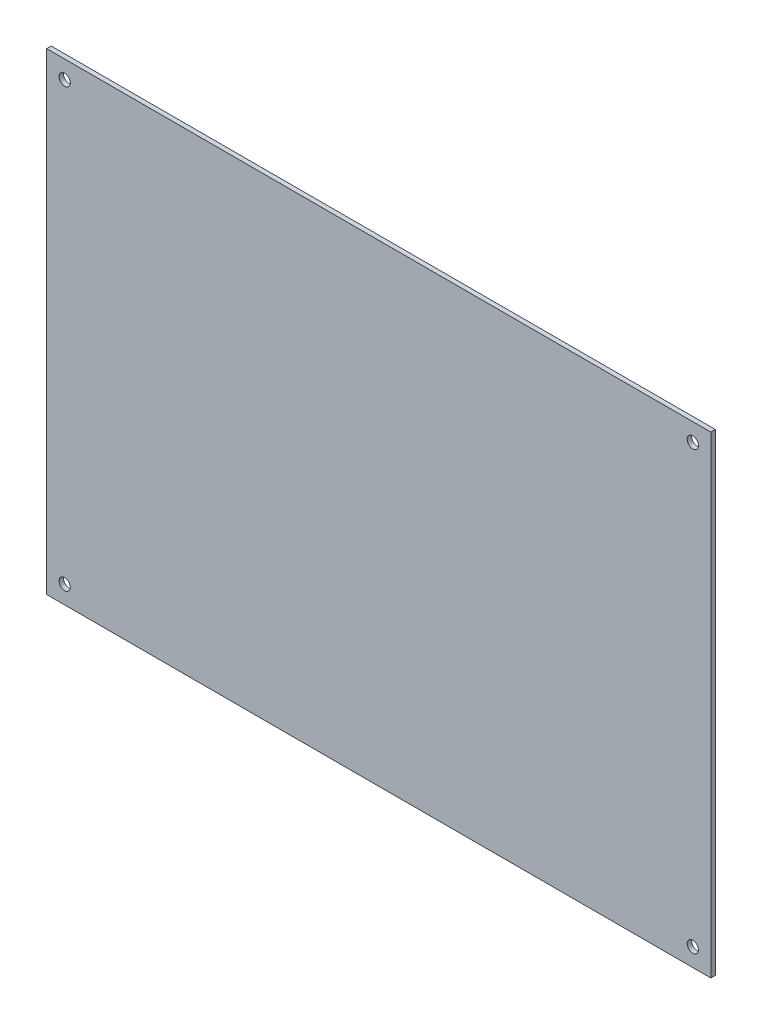
ISO-10303-21;
HEADER;
FILE_DESCRIPTION(('STEP AP214'),'2;1');
FILE_NAME('part.step','',(''),(''),'','','');
FILE_SCHEMA(('AUTOMOTIVE_DESIGN { 1 0 10303 214 1 1 1 1 }'));
ENDSEC;
DATA;
#1=APPLICATION_CONTEXT('core data for automotive mechanical design processes');
#2=APPLICATION_PROTOCOL_DEFINITION('international standard','automotive_design',2000,#1);
#3=PRODUCT_CONTEXT('',#1,'mechanical');
#4=PRODUCT('Part','Part','',(#3));
#5=PRODUCT_RELATED_PRODUCT_CATEGORY('part','',(#4));
#6=PRODUCT_DEFINITION_FORMATION('','',#4);
#7=PRODUCT_DEFINITION_CONTEXT('part definition',#1,'design');
#8=PRODUCT_DEFINITION('design','',#6,#7);
#9=PRODUCT_DEFINITION_SHAPE('','',#8);
#10=(LENGTH_UNIT() NAMED_UNIT(*) SI_UNIT(.MILLI.,.METRE.));
#11=(NAMED_UNIT(*) PLANE_ANGLE_UNIT() SI_UNIT($,.RADIAN.));
#12=(NAMED_UNIT(*) SI_UNIT($,.STERADIAN.) SOLID_ANGLE_UNIT());
#13=UNCERTAINTY_MEASURE_WITH_UNIT(LENGTH_MEASURE(1.E-05),#10,'distance_accuracy_value','');
#14=(GEOMETRIC_REPRESENTATION_CONTEXT(3) GLOBAL_UNCERTAINTY_ASSIGNED_CONTEXT((#13)) GLOBAL_UNIT_ASSIGNED_CONTEXT((#10,
#11,#12)) REPRESENTATION_CONTEXT('',''));
#15=CARTESIAN_POINT('',(0.,0.,0.));
#16=DIRECTION('',(0.,0.,1.));
#17=DIRECTION('',(1.,0.,0.));
#18=AXIS2_PLACEMENT_3D('',#15,#16,#17);
#19=CARTESIAN_POINT('',(147.5,105.,2.));
#20=DIRECTION('',(-1.,0.,0.));
#21=DIRECTION('',(0.,0.,1.));
#22=AXIS2_PLACEMENT_3D('',#19,#20,#21);
#23=PLANE('',#22);
#24=DIRECTION('',(0.,1.,0.));
#25=VECTOR('',#24,1.);
#26=CARTESIAN_POINT('',(147.5,105.,0.));
#27=LINE('',#26,#25);
#28=CARTESIAN_POINT('',(147.5,-105.,0.));
#29=VERTEX_POINT('',#28);
#30=CARTESIAN_POINT('',(147.5,105.,0.));
#31=VERTEX_POINT('',#30);
#32=EDGE_CURVE('E99',#29,#31,#27,.T.);
#33=ORIENTED_EDGE('',*,*,#32,.T.);
#34=DIRECTION('',(0.,0.,-1.));
#35=VECTOR('',#34,1.);
#36=CARTESIAN_POINT('',(147.5,105.,2.));
#37=LINE('',#36,#35);
#38=CARTESIAN_POINT('',(147.5,105.,2.));
#39=VERTEX_POINT('',#38);
#40=EDGE_CURVE('E11',#39,#31,#37,.T.);
#41=ORIENTED_EDGE('',*,*,#40,.F.);
#42=DIRECTION('',(0.,1.,0.));
#43=VECTOR('',#42,1.);
#44=CARTESIAN_POINT('',(147.5,105.,2.));
#45=LINE('',#44,#43);
#46=CARTESIAN_POINT('',(147.5,-105.,2.));
#47=VERTEX_POINT('',#46);
#48=EDGE_CURVE('E86',#47,#39,#45,.T.);
#49=ORIENTED_EDGE('',*,*,#48,.F.);
#50=DIRECTION('',(0.,0.,-1.));
#51=VECTOR('',#50,1.);
#52=CARTESIAN_POINT('',(147.5,-105.,2.));
#53=LINE('',#52,#51);
#54=EDGE_CURVE('E95',#47,#29,#53,.T.);
#55=ORIENTED_EDGE('',*,*,#54,.T.);
#56=EDGE_LOOP('',(#33,#41,#49,#55));
#57=FACE_BOUND('',#56,.T.);
#58=ADVANCED_FACE('F33',(#57),#23,.F.);
#59=CARTESIAN_POINT('',(147.5,105.,2.));
#60=DIRECTION('',(0.,-1.,0.));
#61=DIRECTION('',(1.,0.,0.));
#62=AXIS2_PLACEMENT_3D('',#59,#60,#61);
#63=PLANE('',#62);
#64=DIRECTION('',(-1.,0.,0.));
#65=VECTOR('',#64,1.);
#66=CARTESIAN_POINT('',(147.5,105.,0.));
#67=LINE('',#66,#65);
#68=CARTESIAN_POINT('',(-147.5,105.,0.));
#69=VERTEX_POINT('',#68);
#70=EDGE_CURVE('E90',#31,#69,#67,.T.);
#71=ORIENTED_EDGE('',*,*,#70,.T.);
#72=DIRECTION('',(0.,0.,-1.));
#73=VECTOR('',#72,1.);
#74=CARTESIAN_POINT('',(-147.5,105.,2.));
#75=LINE('',#74,#73);
#76=CARTESIAN_POINT('',(-147.5,105.,2.));
#77=VERTEX_POINT('',#76);
#78=EDGE_CURVE('E42',#77,#69,#75,.T.);
#79=ORIENTED_EDGE('',*,*,#78,.F.);
#80=DIRECTION('',(-1.,0.,0.));
#81=VECTOR('',#80,1.);
#82=CARTESIAN_POINT('',(147.5,105.,2.));
#83=LINE('',#82,#81);
#84=EDGE_CURVE('E81',#39,#77,#83,.T.);
#85=ORIENTED_EDGE('',*,*,#84,.F.);
#86=ORIENTED_EDGE('',*,*,#40,.T.);
#87=EDGE_LOOP('',(#71,#79,#85,#86));
#88=FACE_BOUND('',#87,.T.);
#89=ADVANCED_FACE('F89',(#88),#63,.F.);
#90=CARTESIAN_POINT('',(-147.5,105.,2.));
#91=DIRECTION('',(1.,0.,0.));
#92=DIRECTION('',(0.,1.,0.));
#93=AXIS2_PLACEMENT_3D('',#90,#91,#92);
#94=PLANE('',#93);
#95=DIRECTION('',(0.,-1.,0.));
#96=VECTOR('',#95,1.);
#97=CARTESIAN_POINT('',(-147.5,105.,0.));
#98=LINE('',#97,#96);
#99=CARTESIAN_POINT('',(-147.5,-105.,0.));
#100=VERTEX_POINT('',#99);
#101=EDGE_CURVE('E68',#69,#100,#98,.T.);
#102=ORIENTED_EDGE('',*,*,#101,.T.);
#103=DIRECTION('',(0.,0.,-1.));
#104=VECTOR('',#103,1.);
#105=CARTESIAN_POINT('',(-147.5,-105.,2.));
#106=LINE('',#105,#104);
#107=CARTESIAN_POINT('',(-147.5,-105.,2.));
#108=VERTEX_POINT('',#107);
#109=EDGE_CURVE('E91',#108,#100,#106,.T.);
#110=ORIENTED_EDGE('',*,*,#109,.F.);
#111=DIRECTION('',(0.,-1.,0.));
#112=VECTOR('',#111,1.);
#113=CARTESIAN_POINT('',(-147.5,105.,2.));
#114=LINE('',#113,#112);
#115=EDGE_CURVE('E84',#77,#108,#114,.T.);
#116=ORIENTED_EDGE('',*,*,#115,.F.);
#117=ORIENTED_EDGE('',*,*,#78,.T.);
#118=EDGE_LOOP('',(#102,#110,#116,#117));
#119=FACE_BOUND('',#118,.T.);
#120=ADVANCED_FACE('F93',(#119),#94,.F.);
#121=CARTESIAN_POINT('',(147.5,-105.,2.));
#122=DIRECTION('',(0.,1.,0.));
#123=DIRECTION('',(-1.,0.,0.));
#124=AXIS2_PLACEMENT_3D('',#121,#122,#123);
#125=PLANE('',#124);
#126=DIRECTION('',(1.,0.,0.));
#127=VECTOR('',#126,1.);
#128=CARTESIAN_POINT('',(147.5,-105.,0.));
#129=LINE('',#128,#127);
#130=EDGE_CURVE('E74',#100,#29,#129,.T.);
#131=ORIENTED_EDGE('',*,*,#130,.T.);
#132=ORIENTED_EDGE('',*,*,#54,.F.);
#133=DIRECTION('',(1.,0.,0.));
#134=VECTOR('',#133,1.);
#135=CARTESIAN_POINT('',(147.5,-105.,2.));
#136=LINE('',#135,#134);
#137=EDGE_CURVE('E51',#108,#47,#136,.T.);
#138=ORIENTED_EDGE('',*,*,#137,.F.);
#139=ORIENTED_EDGE('',*,*,#109,.T.);
#140=EDGE_LOOP('',(#131,#132,#138,#139));
#141=FACE_BOUND('',#140,.T.);
#142=ADVANCED_FACE('F136',(#141),#125,.F.);
#143=CARTESIAN_POINT('',(0.,0.,2.));
#144=DIRECTION('',(0.,0.,-1.));
#145=DIRECTION('',(-1.,0.,0.));
#146=AXIS2_PLACEMENT_3D('',#143,#144,#145);
#147=PLANE('',#146);
#148=CARTESIAN_POINT('',(-139.5,-97.,2.));
#149=DIRECTION('',(0.,0.,-1.));
#150=DIRECTION('',(1.,0.,0.));
#151=AXIS2_PLACEMENT_3D('',#148,#149,#150);
#152=CIRCLE('',#151,2.5);
#153=CARTESIAN_POINT('',(-137.,-97.,2.));
#154=VERTEX_POINT('',#153);
#155=EDGE_CURVE('E126',#154,#154,#152,.T.);
#156=ORIENTED_EDGE('',*,*,#155,.T.);
#157=EDGE_LOOP('',(#156));
#158=FACE_BOUND('',#157,.T.);
#159=CARTESIAN_POINT('',(139.5,-97.,2.));
#160=DIRECTION('',(0.,0.,1.));
#161=DIRECTION('',(-1.,0.,0.));
#162=AXIS2_PLACEMENT_3D('',#159,#160,#161);
#163=CIRCLE('',#162,2.5);
#164=CARTESIAN_POINT('',(137.,-97.,2.));
#165=VERTEX_POINT('',#164);
#166=EDGE_CURVE('E116',#165,#165,#163,.T.);
#167=ORIENTED_EDGE('',*,*,#166,.F.);
#168=EDGE_LOOP('',(#167));
#169=FACE_BOUND('',#168,.T.);
#170=CARTESIAN_POINT('',(139.5,97.,2.));
#171=DIRECTION('',(0.,0.,-1.));
#172=DIRECTION('',(-1.,0.,0.));
#173=AXIS2_PLACEMENT_3D('',#170,#171,#172);
#174=CIRCLE('',#173,2.5);
#175=CARTESIAN_POINT('',(137.,97.,2.));
#176=VERTEX_POINT('',#175);
#177=EDGE_CURVE('E113',#176,#176,#174,.T.);
#178=ORIENTED_EDGE('',*,*,#177,.T.);
#179=EDGE_LOOP('',(#178));
#180=FACE_BOUND('',#179,.T.);
#181=CARTESIAN_POINT('',(-139.5,97.,2.));
#182=DIRECTION('',(0.,0.,1.));
#183=DIRECTION('',(1.,0.,0.));
#184=AXIS2_PLACEMENT_3D('',#181,#182,#183);
#185=CIRCLE('',#184,2.5);
#186=CARTESIAN_POINT('',(-137.,97.,2.));
#187=VERTEX_POINT('',#186);
#188=EDGE_CURVE('E110',#187,#187,#185,.T.);
#189=ORIENTED_EDGE('',*,*,#188,.F.);
#190=EDGE_LOOP('',(#189));
#191=FACE_BOUND('',#190,.T.);
#192=ORIENTED_EDGE('',*,*,#48,.T.);
#193=ORIENTED_EDGE('',*,*,#84,.T.);
#194=ORIENTED_EDGE('',*,*,#115,.T.);
#195=ORIENTED_EDGE('',*,*,#137,.T.);
#196=EDGE_LOOP('',(#192,#193,#194,#195));
#197=FACE_BOUND('',#196,.T.);
#198=ADVANCED_FACE('F82',(#158,#169,#180,#191,#197),#147,.F.);
#199=CARTESIAN_POINT('',(0.,0.,0.));
#200=DIRECTION('',(0.,0.,-1.));
#201=DIRECTION('',(-1.,0.,0.));
#202=AXIS2_PLACEMENT_3D('',#199,#200,#201);
#203=PLANE('',#202);
#204=CARTESIAN_POINT('',(-139.5,-97.,0.));
#205=DIRECTION('',(0.,0.,-1.));
#206=DIRECTION('',(-1.,0.,0.));
#207=AXIS2_PLACEMENT_3D('',#204,#205,#206);
#208=CIRCLE('',#207,2.5);
#209=CARTESIAN_POINT('',(-142.,-97.,0.));
#210=VERTEX_POINT('',#209);
#211=EDGE_CURVE('E36',#210,#210,#208,.F.);
#212=ORIENTED_EDGE('',*,*,#211,.T.);
#213=EDGE_LOOP('',(#212));
#214=FACE_BOUND('',#213,.T.);
#215=CARTESIAN_POINT('',(139.5,-97.,0.));
#216=DIRECTION('',(0.,0.,-1.));
#217=DIRECTION('',(-1.,0.,0.));
#218=AXIS2_PLACEMENT_3D('',#215,#216,#217);
#219=CIRCLE('',#218,2.5);
#220=CARTESIAN_POINT('',(137.,-97.,0.));
#221=VERTEX_POINT('',#220);
#222=EDGE_CURVE('E114',#221,#221,#219,.T.);
#223=ORIENTED_EDGE('',*,*,#222,.F.);
#224=EDGE_LOOP('',(#223));
#225=FACE_BOUND('',#224,.T.);
#226=CARTESIAN_POINT('',(139.5,97.,0.));
#227=DIRECTION('',(0.,0.,-1.));
#228=DIRECTION('',(-1.,0.,0.));
#229=AXIS2_PLACEMENT_3D('',#226,#227,#228);
#230=CIRCLE('',#229,2.5);
#231=CARTESIAN_POINT('',(137.,97.,0.));
#232=VERTEX_POINT('',#231);
#233=EDGE_CURVE('E111',#232,#232,#230,.F.);
#234=ORIENTED_EDGE('',*,*,#233,.T.);
#235=EDGE_LOOP('',(#234));
#236=FACE_BOUND('',#235,.T.);
#237=CARTESIAN_POINT('',(-139.5,97.,0.));
#238=DIRECTION('',(0.,0.,-1.));
#239=DIRECTION('',(-1.,0.,0.));
#240=AXIS2_PLACEMENT_3D('',#237,#238,#239);
#241=CIRCLE('',#240,2.5);
#242=CARTESIAN_POINT('',(-142.,97.,0.));
#243=VERTEX_POINT('',#242);
#244=EDGE_CURVE('E102',#243,#243,#241,.T.);
#245=ORIENTED_EDGE('',*,*,#244,.F.);
#246=EDGE_LOOP('',(#245));
#247=FACE_BOUND('',#246,.T.);
#248=ORIENTED_EDGE('',*,*,#32,.F.);
#249=ORIENTED_EDGE('',*,*,#130,.F.);
#250=ORIENTED_EDGE('',*,*,#101,.F.);
#251=ORIENTED_EDGE('',*,*,#70,.F.);
#252=EDGE_LOOP('',(#248,#249,#250,#251));
#253=FACE_BOUND('',#252,.T.);
#254=ADVANCED_FACE('F135',(#214,#225,#236,#247,#253),#203,.T.);
#255=CARTESIAN_POINT('',(-139.5,97.,-8.));
#256=DIRECTION('',(0.,0.,1.));
#257=DIRECTION('',(1.,0.,0.));
#258=AXIS2_PLACEMENT_3D('',#255,#256,#257);
#259=CYLINDRICAL_SURFACE('',#258,2.5);
#260=ORIENTED_EDGE('',*,*,#244,.T.);
#261=EDGE_LOOP('',(#260));
#262=FACE_BOUND('',#261,.T.);
#263=ORIENTED_EDGE('',*,*,#188,.T.);
#264=EDGE_LOOP('',(#263));
#265=FACE_BOUND('',#264,.T.);
#266=ADVANCED_FACE('F132',(#262,#265),#259,.F.);
#267=CARTESIAN_POINT('',(139.5,97.,-8.));
#268=DIRECTION('',(0.,0.,1.));
#269=DIRECTION('',(1.,0.,0.));
#270=AXIS2_PLACEMENT_3D('',#267,#268,#269);
#271=CYLINDRICAL_SURFACE('',#270,2.5);
#272=ORIENTED_EDGE('',*,*,#233,.F.);
#273=EDGE_LOOP('',(#272));
#274=FACE_BOUND('',#273,.T.);
#275=ORIENTED_EDGE('',*,*,#177,.F.);
#276=EDGE_LOOP('',(#275));
#277=FACE_BOUND('',#276,.T.);
#278=ADVANCED_FACE('F185',(#274,#277),#271,.F.);
#279=CARTESIAN_POINT('',(139.5,-97.,-8.));
#280=DIRECTION('',(0.,0.,1.));
#281=DIRECTION('',(1.,0.,0.));
#282=AXIS2_PLACEMENT_3D('',#279,#280,#281);
#283=CYLINDRICAL_SURFACE('',#282,2.5);
#284=ORIENTED_EDGE('',*,*,#222,.T.);
#285=EDGE_LOOP('',(#284));
#286=FACE_BOUND('',#285,.T.);
#287=ORIENTED_EDGE('',*,*,#166,.T.);
#288=EDGE_LOOP('',(#287));
#289=FACE_BOUND('',#288,.T.);
#290=ADVANCED_FACE('F190',(#286,#289),#283,.F.);
#291=CARTESIAN_POINT('',(-139.5,-97.,-8.));
#292=DIRECTION('',(0.,0.,1.));
#293=DIRECTION('',(1.,0.,0.));
#294=AXIS2_PLACEMENT_3D('',#291,#292,#293);
#295=CYLINDRICAL_SURFACE('',#294,2.5);
#296=ORIENTED_EDGE('',*,*,#211,.F.);
#297=EDGE_LOOP('',(#296));
#298=FACE_BOUND('',#297,.T.);
#299=ORIENTED_EDGE('',*,*,#155,.F.);
#300=EDGE_LOOP('',(#299));
#301=FACE_BOUND('',#300,.T.);
#302=ADVANCED_FACE('F197',(#298,#301),#295,.F.);
#303=CLOSED_SHELL('',(#58,#89,#120,#142,#198,#254,#266,#278,#290,#302));
#304=MANIFOLD_SOLID_BREP('B2',#303);
#305=ADVANCED_BREP_SHAPE_REPRESENTATION('',(#18,#304),#14);
#306=SHAPE_DEFINITION_REPRESENTATION(#9,#305);
ENDSEC;
END-ISO-10303-21;
